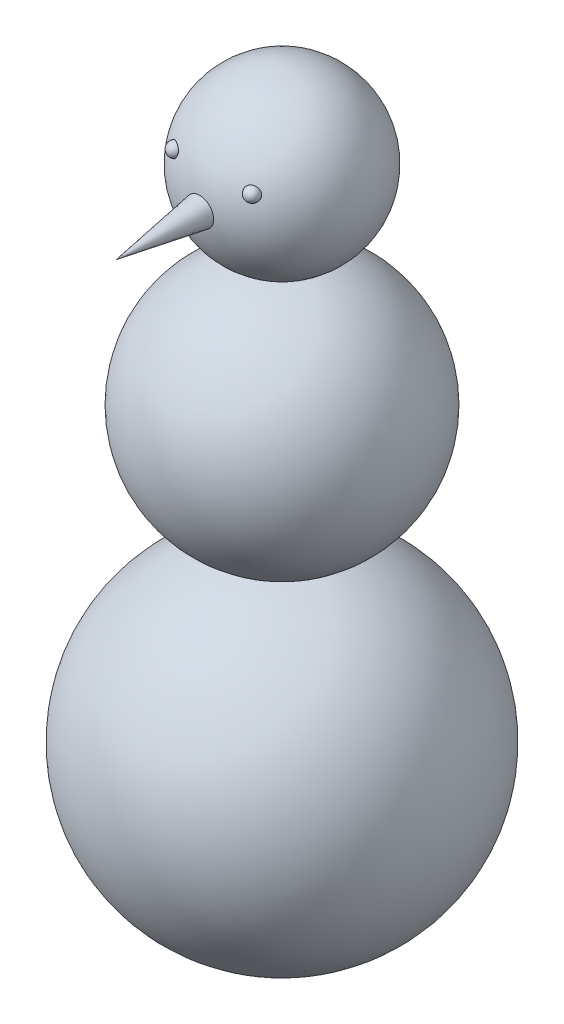
ISO-10303-21;
HEADER;
FILE_DESCRIPTION(('STEP AP214'),'2;1');
FILE_NAME('part.step','',(''),(''),'','','');
FILE_SCHEMA(('AUTOMOTIVE_DESIGN { 1 0 10303 214 1 1 1 1 }'));
ENDSEC;
DATA;
#1=APPLICATION_CONTEXT('core data for automotive mechanical design processes');
#2=APPLICATION_PROTOCOL_DEFINITION('international standard','automotive_design',2000,#1);
#3=PRODUCT_CONTEXT('',#1,'mechanical');
#4=PRODUCT('Part','Part','',(#3));
#5=PRODUCT_RELATED_PRODUCT_CATEGORY('part','',(#4));
#6=PRODUCT_DEFINITION_FORMATION('','',#4);
#7=PRODUCT_DEFINITION_CONTEXT('part definition',#1,'design');
#8=PRODUCT_DEFINITION('design','',#6,#7);
#9=PRODUCT_DEFINITION_SHAPE('','',#8);
#10=(LENGTH_UNIT() NAMED_UNIT(*) SI_UNIT(.MILLI.,.METRE.));
#11=(NAMED_UNIT(*) PLANE_ANGLE_UNIT() SI_UNIT($,.RADIAN.));
#12=(NAMED_UNIT(*) SI_UNIT($,.STERADIAN.) SOLID_ANGLE_UNIT());
#13=UNCERTAINTY_MEASURE_WITH_UNIT(LENGTH_MEASURE(1.E-05),#10,'distance_accuracy_value','');
#14=(GEOMETRIC_REPRESENTATION_CONTEXT(3) GLOBAL_UNCERTAINTY_ASSIGNED_CONTEXT((#13)) GLOBAL_UNIT_ASSIGNED_CONTEXT((#10,
#11,#12)) REPRESENTATION_CONTEXT('',''));
#15=CARTESIAN_POINT('',(0.,0.,0.));
#16=DIRECTION('',(0.,0.,1.));
#17=DIRECTION('',(1.,0.,0.));
#18=AXIS2_PLACEMENT_3D('',#15,#16,#17);
#19=CARTESIAN_POINT('',(0.,914.4,0.));
#20=DIRECTION('',(0.,-1.,0.));
#21=DIRECTION('',(-1.,0.,0.));
#22=AXIS2_PLACEMENT_3D('',#19,#20,#21);
#23=SPHERICAL_SURFACE('',#22,152.4);
#24=CARTESIAN_POINT('',(0.,914.4,150.26842649073));
#25=DIRECTION('',(0.,0.,-1.));
#26=DIRECTION('',(-1.,0.,0.));
#27=AXIS2_PLACEMENT_3D('',#24,#25,#26);
#28=CIRCLE('',#27,25.4);
#29=CARTESIAN_POINT('',(-25.4,914.4,150.26842649073));
#30=VERTEX_POINT('',#29);
#31=EDGE_CURVE('E123',#30,#30,#28,.T.);
#32=ORIENTED_EDGE('',*,*,#31,.T.);
#33=EDGE_LOOP('',(#32));
#34=FACE_BOUND('',#33,.T.);
#35=CARTESIAN_POINT('',(70.632787724483,965.2,125.124455236649));
#36=CARTESIAN_POINT('',(70.6326186899656,965.200063848411,125.124524734493));
#37=CARTESIAN_POINT('',(70.6324496553251,965.20012769698,125.124594231893));
#38=CARTESIAN_POINT('',(70.6321117386533,965.20025533649,125.124733163045));
#39=CARTESIAN_POINT('',(70.631942856622,965.20031912743,125.124802596798));
#40=CARTESIAN_POINT('',(70.6310984456866,965.200638081951,125.12514976383));
#41=CARTESIAN_POINT('',(70.6304229144443,965.200893244987,125.125427491924));
#42=CARTESIAN_POINT('',(70.6270452461944,965.202169059785,125.126816103465));
#43=CARTESIAN_POINT('',(70.6243430730746,965.2031897104,125.127926900125));
#44=CARTESIAN_POINT('',(70.6108320140857,965.208292953173,125.133480422708));
#45=CARTESIAN_POINT('',(70.6000225482999,965.21237551433,125.137921766369));
#46=CARTESIAN_POINT('',(70.5459721243665,965.232788163068,125.160121110532));
#47=CARTESIAN_POINT('',(70.5027218974501,965.249117773379,125.177856981934));
#48=CARTESIAN_POINT('',(70.2864210652077,965.33076336617,125.266418426689));
#49=CARTESIAN_POINT('',(70.113222406627,965.396071579628,125.336889835791));
#50=CARTESIAN_POINT('',(69.2464245818237,965.722576866616,125.687364128247));
#51=CARTESIAN_POINT('',(68.5504783712359,965.983641461147,125.96169139041));
#52=CARTESIAN_POINT('',(66.4545919187476,966.766610866138,126.766710161479));
#53=CARTESIAN_POINT('',(65.0473682626832,967.288000952464,127.27911388246));
#54=CARTESIAN_POINT('',(62.9231975126563,968.068602119726,128.010707054898));
#55=CARTESIAN_POINT('',(62.2128486955579,968.328580257245,128.248423914074));
#56=CARTESIAN_POINT('',(60.7878738553021,968.847980254103,128.711462807009));
#57=CARTESIAN_POINT('',(60.0732475529545,969.107402075595,128.936784021706));
#58=CARTESIAN_POINT('',(56.641901803289,970.347987787387,129.985758643503));
#59=CARTESIAN_POINT('',(53.8976966841214,971.325043578881,130.726285852884));
#60=CARTESIAN_POINT('',(48.3610487479235,973.266434621027,132.025541087695));
#61=CARTESIAN_POINT('',(45.5685881935664,974.230764954144,132.584200699657));
#62=CARTESIAN_POINT('',(41.3490886552726,975.665838248132,133.284587234015));
#63=CARTESIAN_POINT('',(39.9353834234604,976.142975257817,133.495320645088));
#64=CARTESIAN_POINT('',(37.1001863989797,977.09256072012,133.870268704049));
#65=CARTESIAN_POINT('',(35.6786945493295,977.565009138356,134.03448301105));
#66=CARTESIAN_POINT('',(32.8298954129761,978.504562001686,134.316163278837));
#67=CARTESIAN_POINT('',(31.4025903293799,978.971668254561,134.433645537402));
#68=CARTESIAN_POINT('',(28.5430817662526,979.900244794336,134.621839135923));
#69=CARTESIAN_POINT('',(27.1108783172458,980.361715116274,134.6925507668));
#70=CARTESIAN_POINT('',(25.6769217527268,980.82014057487,134.739825646759));
#71=B_SPLINE_CURVE_WITH_KNOTS('',3,(#35,#36,#37,#38,#39,#40,#41,#42,#43,#44,#45,#46,#47,#48,#49,
#50,#51,#52,#53,#54,#55,#56,#57,#58,#59,#60,#61,#62,#63,#64,#65,#66,#67,#68,#69,#70),
.UNSPECIFIED.,.F.,.F.,(4,2,2,2,2,2,2,2,2,2,2,2,2,2,2,2,2,4),(0.,0.000580786658377329,
0.00116104800865767,0.00348209340981893,0.0127662750190276,0.0499030017465191,0.198449927262511,
0.792638820124542,3.16947061174009,7.92577241576755,10.3043835207888,12.6831516077885,
21.6934449174305,30.7071237396068,35.2270791411994,39.7470676637245,44.2654784576226,
48.7838611461343),.UNSPECIFIED.);
#72=CARTESIAN_POINT('',(59.3378642558464,969.373275956889,129.161591799275));
#73=VERTEX_POINT('',#72);
#74=CARTESIAN_POINT('',(70.632787724483,965.2,125.124455236649));
#75=VERTEX_POINT('',#74);
#76=EDGE_CURVE('E110',#73,#75,#71,.F.);
#77=ORIENTED_EDGE('',*,*,#76,.T.);
#78=CARTESIAN_POINT('',(70.632787724483,965.2,125.124455236649));
#79=CARTESIAN_POINT('',(70.632956313379,965.199999999785,125.12436006826));
#80=CARTESIAN_POINT('',(70.633124902052,965.199999999746,125.124264899476));
#81=CARTESIAN_POINT('',(70.6334619265036,965.199999999816,125.124074647261));
#82=CARTESIAN_POINT('',(70.6336303622825,965.199999999923,125.12397956383));
#83=CARTESIAN_POINT('',(70.6344725402436,965.200000000308,125.12350414502));
#84=CARTESIAN_POINT('',(70.6351462796254,965.200000000129,125.123123804681));
#85=CARTESIAN_POINT('',(70.6385149611309,965.199999999486,125.121222075696));
#86=CARTESIAN_POINT('',(70.6412098570414,965.199999999785,125.119700605191));
#87=CARTESIAN_POINT('',(70.6546840909743,965.200000000858,125.112092817419));
#88=CARTESIAN_POINT('',(70.6654626918842,965.200000000358,125.106005194559));
#89=CARTESIAN_POINT('',(70.7193517672475,965.199999998566,125.075560112966));
#90=CARTESIAN_POINT('',(70.7624504379391,965.199999999402,125.051181761504));
#91=CARTESIAN_POINT('',(70.9778810983769,965.200000002393,124.929178430055));
#92=CARTESIAN_POINT('',(71.1500239720793,965.200000000991,124.831219313025));
#93=CARTESIAN_POINT('',(72.009744596154,965.199999996035,124.339633257871));
#94=CARTESIAN_POINT('',(72.6942747375153,965.199999998636,123.940672379068));
#95=CARTESIAN_POINT('',(74.7386308749941,965.200000002729,122.726405392283));
#96=CARTESIAN_POINT('',(76.0884516808625,965.200000000503,121.894138965378));
#97=CARTESIAN_POINT('',(78.0920006065753,965.199999999752,120.612554075788));
#98=CARTESIAN_POINT('',(78.7563831077579,965.199999999933,120.17978477104));
#99=CARTESIAN_POINT('',(80.0779293770016,965.200000000068,119.303285982425));
#100=CARTESIAN_POINT('',(80.735092665752,965.200000000023,118.8595557771));
#101=CARTESIAN_POINT('',(83.8638063451609,965.199999999912,116.70904769035));
#102=CARTESIAN_POINT('',(86.286147958519,965.200000000142,114.929738439044));
#103=CARTESIAN_POINT('',(91.0153288868217,965.200000000368,111.22212715137));
#104=CARTESIAN_POINT('',(93.3221244611416,965.200000000364,109.293769383904));
#105=CARTESIAN_POINT('',(96.6911099480694,965.199999999818,106.29308782813));
#106=CARTESIAN_POINT('',(97.8004445281128,965.199999999545,105.273280214643));
#107=CARTESIAN_POINT('',(99.9865346263031,965.200000000457,103.199238062865));
#108=CARTESIAN_POINT('',(101.063289905661,965.200000001642,102.145003272357));
#109=CARTESIAN_POINT('',(103.182726788895,965.200000001791,100.003567498507));
#110=CARTESIAN_POINT('',(104.225420155198,965.200000000755,98.9163781506559));
#111=CARTESIAN_POINT('',(106.27610621773,965.199999999253,96.7097637492981));
#112=CARTESIAN_POINT('',(107.284099129764,965.199999998787,95.5903388963461));
#113=CARTESIAN_POINT('',(108.27423806739,965.2,94.4553300292057));
#114=B_SPLINE_CURVE_WITH_KNOTS('',3,(#78,#79,#80,#81,#82,#83,#84,#85,#86,#87,#88,#89,#90,#91,
#92,#93,#94,#95,#96,#97,#98,#99,#100,#101,#102,#103,#104,#105,#106,#107,#108,#109,#110,#111,
#112,#113),.UNSPECIFIED.,.F.,.F.,(4,2,2,2,2,2,2,2,2,2,2,2,2,2,2,2,2,4),(0.,0.000580786658345131,
0.00116104800859367,0.00348209340963334,0.0127662750183127,0.0499030017437832,0.198449927251762,
0.79263882008179,3.16947061156935,7.92577241534032,10.3043835202333,12.6831516071046,
21.6934449167465,30.7071237389226,35.2270791405154,39.7470676630405,44.2654784569386,
48.7838611454504),.UNSPECIFIED.);
#115=CARTESIAN_POINT('',(81.40561663165,965.2,118.398672208859));
#116=VERTEX_POINT('',#115);
#117=EDGE_CURVE('E88',#75,#116,#114,.T.);
#118=ORIENTED_EDGE('',*,*,#117,.T.);
#119=CARTESIAN_POINT('',(70.3875349893286,965.023611111111,124.689995322633));
#120=DIRECTION('',(0.463469735724954,0.333333333333333,0.821026609164362));
#121=DIRECTION('',(0.870830224312076,0.,-0.491583889508778));
#122=AXIS2_PLACEMENT_3D('',#119,#120,#121);
#123=CIRCLE('',#122,12.6889709054315);
#124=EDGE_CURVE('E122',#116,#73,#123,.F.);
#125=ORIENTED_EDGE('',*,*,#124,.T.);
#126=EDGE_LOOP('',(#77,#118,#125));
#127=FACE_BOUND('',#126,.T.);
#128=CARTESIAN_POINT('',(-70.632787724483,965.2,125.124455236649));
#129=CARTESIAN_POINT('',(-70.632956313379,965.199999999785,125.12436006826));
#130=CARTESIAN_POINT('',(-70.633124902052,965.199999999746,125.124264899476));
#131=CARTESIAN_POINT('',(-70.6334619265036,965.199999999816,125.124074647261));
#132=CARTESIAN_POINT('',(-70.6336303622825,965.199999999923,125.12397956383));
#133=CARTESIAN_POINT('',(-70.6344725402436,965.200000000308,125.12350414502));
#134=CARTESIAN_POINT('',(-70.6351462796254,965.200000000129,125.123123804681));
#135=CARTESIAN_POINT('',(-70.6385149611309,965.199999999486,125.121222075696));
#136=CARTESIAN_POINT('',(-70.6412098570414,965.199999999785,125.119700605191));
#137=CARTESIAN_POINT('',(-70.6546840909743,965.200000000858,125.112092817419));
#138=CARTESIAN_POINT('',(-70.6654626918842,965.200000000358,125.106005194559));
#139=CARTESIAN_POINT('',(-70.7193517672475,965.199999998566,125.075560112966));
#140=CARTESIAN_POINT('',(-70.7624504379391,965.199999999402,125.051181761504));
#141=CARTESIAN_POINT('',(-70.9778810983769,965.200000002393,124.929178430055));
#142=CARTESIAN_POINT('',(-71.1500239720793,965.200000000991,124.831219313025));
#143=CARTESIAN_POINT('',(-72.009744596154,965.199999996035,124.339633257871));
#144=CARTESIAN_POINT('',(-72.6942747375153,965.199999998636,123.940672379068));
#145=CARTESIAN_POINT('',(-74.7386308749941,965.200000002729,122.726405392283));
#146=CARTESIAN_POINT('',(-76.0884516808625,965.200000000503,121.894138965378));
#147=CARTESIAN_POINT('',(-78.0920006065753,965.199999999752,120.612554075788));
#148=CARTESIAN_POINT('',(-78.7563831077579,965.199999999933,120.17978477104));
#149=CARTESIAN_POINT('',(-80.0779293770016,965.200000000068,119.303285982425));
#150=CARTESIAN_POINT('',(-80.735092665752,965.200000000023,118.8595557771));
#151=CARTESIAN_POINT('',(-83.8638063451609,965.199999999912,116.70904769035));
#152=CARTESIAN_POINT('',(-86.286147958519,965.200000000142,114.929738439044));
#153=CARTESIAN_POINT('',(-91.0153288868217,965.200000000368,111.22212715137));
#154=CARTESIAN_POINT('',(-93.3221244611416,965.200000000364,109.293769383904));
#155=CARTESIAN_POINT('',(-96.6911099480694,965.199999999818,106.29308782813));
#156=CARTESIAN_POINT('',(-97.8004445281128,965.199999999545,105.273280214643));
#157=CARTESIAN_POINT('',(-99.9865346263031,965.200000000457,103.199238062865));
#158=CARTESIAN_POINT('',(-101.063289905661,965.200000001642,102.145003272357));
#159=CARTESIAN_POINT('',(-103.182726788895,965.200000001791,100.003567498507));
#160=CARTESIAN_POINT('',(-104.225420155198,965.200000000755,98.9163781506559));
#161=CARTESIAN_POINT('',(-106.27610621773,965.199999999253,96.7097637492981));
#162=CARTESIAN_POINT('',(-107.284099129764,965.199999998787,95.5903388963461));
#163=CARTESIAN_POINT('',(-108.27423806739,965.2,94.4553300292057));
#164=B_SPLINE_CURVE_WITH_KNOTS('',3,(#128,#129,#130,#131,#132,#133,#134,#135,#136,#137,#138,
#139,#140,#141,#142,#143,#144,#145,#146,#147,#148,#149,#150,#151,#152,#153,#154,#155,#156,#157,
#158,#159,#160,#161,#162,#163),.UNSPECIFIED.,.F.,.F.,(4,2,2,2,2,2,2,2,2,2,2,2,2,2,2,2,2,4),(0.,
0.000580786658345131,0.00116104800859367,0.00348209340963334,0.0127662750183127,
0.0499030017437832,0.198449927251762,0.79263882008179,3.16947061156935,7.92577241534032,
10.3043835202333,12.6831516071046,21.6934449167465,30.7071237389226,35.2270791405154,
39.7470676630405,44.2654784569386,48.7838611454504),.UNSPECIFIED.);
#165=CARTESIAN_POINT('',(-81.40561663165,965.2,118.398672208859));
#166=VERTEX_POINT('',#165);
#167=CARTESIAN_POINT('',(-70.632787724483,965.2,125.124455236649));
#168=VERTEX_POINT('',#167);
#169=EDGE_CURVE('E55',#166,#168,#164,.F.);
#170=ORIENTED_EDGE('',*,*,#169,.T.);
#171=CARTESIAN_POINT('',(-70.632787724483,965.2,125.124455236649));
#172=CARTESIAN_POINT('',(-70.6326186899656,965.200063848411,125.124524734493));
#173=CARTESIAN_POINT('',(-70.6324496553251,965.20012769698,125.124594231893));
#174=CARTESIAN_POINT('',(-70.6321117386533,965.20025533649,125.124733163045));
#175=CARTESIAN_POINT('',(-70.631942856622,965.20031912743,125.124802596798));
#176=CARTESIAN_POINT('',(-70.6310984456866,965.200638081951,125.12514976383));
#177=CARTESIAN_POINT('',(-70.6304229144443,965.200893244987,125.125427491924));
#178=CARTESIAN_POINT('',(-70.6270452461944,965.202169059785,125.126816103465));
#179=CARTESIAN_POINT('',(-70.6243430730746,965.2031897104,125.127926900125));
#180=CARTESIAN_POINT('',(-70.6108320140857,965.208292953173,125.133480422708));
#181=CARTESIAN_POINT('',(-70.6000225482999,965.21237551433,125.137921766369));
#182=CARTESIAN_POINT('',(-70.5459721243665,965.232788163068,125.160121110532));
#183=CARTESIAN_POINT('',(-70.5027218974501,965.249117773379,125.177856981934));
#184=CARTESIAN_POINT('',(-70.2864210652077,965.33076336617,125.266418426689));
#185=CARTESIAN_POINT('',(-70.113222406627,965.396071579628,125.336889835791));
#186=CARTESIAN_POINT('',(-69.2464245818237,965.722576866616,125.687364128247));
#187=CARTESIAN_POINT('',(-68.5504783712359,965.983641461147,125.96169139041));
#188=CARTESIAN_POINT('',(-66.4545919187476,966.766610866138,126.766710161479));
#189=CARTESIAN_POINT('',(-65.0473682626832,967.288000952464,127.27911388246));
#190=CARTESIAN_POINT('',(-62.9231975126563,968.068602119726,128.010707054898));
#191=CARTESIAN_POINT('',(-62.2128486955579,968.328580257245,128.248423914074));
#192=CARTESIAN_POINT('',(-60.7878738553021,968.847980254103,128.711462807009));
#193=CARTESIAN_POINT('',(-60.0732475529545,969.107402075595,128.936784021706));
#194=CARTESIAN_POINT('',(-56.641901803289,970.347987787387,129.985758643503));
#195=CARTESIAN_POINT('',(-53.8976966841214,971.325043578881,130.726285852884));
#196=CARTESIAN_POINT('',(-48.3610487479235,973.266434621027,132.025541087695));
#197=CARTESIAN_POINT('',(-45.5685881935664,974.230764954144,132.584200699657));
#198=CARTESIAN_POINT('',(-41.3490886552726,975.665838248132,133.284587234015));
#199=CARTESIAN_POINT('',(-39.9353834234604,976.142975257817,133.495320645088));
#200=CARTESIAN_POINT('',(-37.1001863989797,977.09256072012,133.870268704049));
#201=CARTESIAN_POINT('',(-35.6786945493295,977.565009138356,134.03448301105));
#202=CARTESIAN_POINT('',(-32.8298954129761,978.504562001686,134.316163278837));
#203=CARTESIAN_POINT('',(-31.4025903293799,978.971668254561,134.433645537402));
#204=CARTESIAN_POINT('',(-28.5430817662526,979.900244794336,134.621839135923));
#205=CARTESIAN_POINT('',(-27.1108783172458,980.361715116274,134.6925507668));
#206=CARTESIAN_POINT('',(-25.6769217527268,980.82014057487,134.739825646759));
#207=B_SPLINE_CURVE_WITH_KNOTS('',3,(#171,#172,#173,#174,#175,#176,#177,#178,#179,#180,#181,
#182,#183,#184,#185,#186,#187,#188,#189,#190,#191,#192,#193,#194,#195,#196,#197,#198,#199,#200,
#201,#202,#203,#204,#205,#206),.UNSPECIFIED.,.F.,.F.,(4,2,2,2,2,2,2,2,2,2,2,2,2,2,2,2,2,4),(0.,
0.000580786658377329,0.00116104800865767,0.00348209340981893,0.0127662750190276,
0.0499030017465191,0.198449927262511,0.792638820124542,3.16947061174009,7.92577241576755,
10.3043835207888,12.6831516077885,21.6934449174305,30.7071237396068,35.2270791411994,
39.7470676637245,44.2654784576226,48.7838611461343),.UNSPECIFIED.);
#208=CARTESIAN_POINT('',(-59.3378642558464,969.373275956889,129.161591799275));
#209=VERTEX_POINT('',#208);
#210=EDGE_CURVE('E12',#168,#209,#207,.T.);
#211=ORIENTED_EDGE('',*,*,#210,.T.);
#212=CARTESIAN_POINT('',(-70.3875349893286,965.023611111111,124.689995322633));
#213=DIRECTION('',(-0.463469735724954,0.333333333333333,0.821026609164362));
#214=DIRECTION('',(0.870830224312076,0.,0.491583889508778));
#215=AXIS2_PLACEMENT_3D('',#212,#213,#214);
#216=CIRCLE('',#215,12.6889709054315);
#217=EDGE_CURVE('E87',#209,#166,#216,.F.);
#218=ORIENTED_EDGE('',*,*,#217,.T.);
#219=EDGE_LOOP('',(#170,#211,#218));
#220=FACE_BOUND('',#219,.T.);
#221=ADVANCED_FACE('F43',(#34,#127,#220),#23,.T.);
#222=CARTESIAN_POINT('',(0.,914.4,302.66842649073));
#223=DIRECTION('',(0.,0.,-1.));
#224=DIRECTION('',(-1.,0.,0.));
#225=AXIS2_PLACEMENT_3D('',#222,#223,#224);
#226=CONICAL_SURFACE('',#225,0.,0.165148677414627);
#227=ORIENTED_EDGE('',*,*,#31,.F.);
#228=EDGE_LOOP('',(#227));
#229=FACE_BOUND('',#228,.T.);
#230=CARTESIAN_POINT('',(0.,914.4,302.66842649073));
#231=VERTEX_POINT('',#230);
#232=VERTEX_LOOP('',#231);
#233=FACE_BOUND('',#232,.T.);
#234=ADVANCED_FACE('F106',(#229,#233),#226,.T.);
#235=CARTESIAN_POINT('',(0.,965.2,0.));
#236=DIRECTION('',(0.,-1.,0.));
#237=DIRECTION('',(0.898797936161028,0.,-0.438363171300553));
#238=AXIS2_PLACEMENT_3D('',#235,#236,#237);
#239=CIRCLE('',#238,143.684097937106);
#240=TRIMMED_CURVE('',#239,(PARAMETER_VALUE(-1.51066541063502)),
(PARAMETER_VALUE(1.51066541063502)),.T.,.PARAMETER.);
#241=CARTESIAN_POINT('',(7.76080634302487,965.2,-3.78511291971675));
#242=DIRECTION('',(0.438363171300553,0.,0.898797936161028));
#243=AXIS1_PLACEMENT('',#241,#242);
#244=SURFACE_OF_REVOLUTION('',#240,#243);
#245=ORIENTED_EDGE('',*,*,#117,.F.);
#246=ORIENTED_EDGE('',*,*,#76,.F.);
#247=CARTESIAN_POINT('',(70.0529610488917,965.2,123.935607601921));
#248=DIRECTION('',(0.438363171300553,0.,0.898797936161028));
#249=DIRECTION('',(0.898797936161028,0.,-0.438363171300553));
#250=AXIS2_PLACEMENT_3D('',#247,#248,#249);
#251=CIRCLE('',#250,12.630931965919);
#252=EDGE_CURVE('E68',#116,#73,#251,.T.);
#253=ORIENTED_EDGE('',*,*,#252,.F.);
#254=EDGE_LOOP('',(#245,#246,#253));
#255=FACE_BOUND('',#254,.T.);
#256=ADVANCED_FACE('F103',(#255),#244,.F.);
#257=CARTESIAN_POINT('',(70.632787724483,965.2,125.124455236649));
#258=DIRECTION('',(0.438363171300553,0.,0.898797936161028));
#259=DIRECTION('',(0.898797936161028,0.,-0.438363171300553));
#260=AXIS2_PLACEMENT_3D('',#257,#258,#259);
#261=SPHERICAL_SURFACE('',#260,12.7);
#262=ORIENTED_EDGE('',*,*,#124,.F.);
#263=ORIENTED_EDGE('',*,*,#252,.T.);
#264=EDGE_LOOP('',(#262,#263));
#265=FACE_BOUND('',#264,.T.);
#266=ADVANCED_FACE('F99',(#265),#261,.T.);
#267=CARTESIAN_POINT('',(0.,965.2,0.));
#268=DIRECTION('',(0.,1.,0.));
#269=DIRECTION('',(-0.898797936161028,0.,-0.438363171300553));
#270=AXIS2_PLACEMENT_3D('',#267,#268,#269);
#271=CIRCLE('',#270,143.684097937106);
#272=TRIMMED_CURVE('',#271,(PARAMETER_VALUE(-1.51066541063502)),
(PARAMETER_VALUE(1.51066541063502)),.T.,.PARAMETER.);
#273=CARTESIAN_POINT('',(-7.76080634302487,965.2,-3.78511291971675));
#274=DIRECTION('',(-0.438363171300553,0.,0.898797936161028));
#275=AXIS1_PLACEMENT('',#273,#274);
#276=SURFACE_OF_REVOLUTION('',#272,#275);
#277=ORIENTED_EDGE('',*,*,#210,.F.);
#278=ORIENTED_EDGE('',*,*,#169,.F.);
#279=CARTESIAN_POINT('',(-70.0529610488917,965.2,123.935607601921));
#280=DIRECTION('',(0.438363171300553,0.,-0.898797936161028));
#281=DIRECTION('',(-0.898797936161028,0.,-0.438363171300553));
#282=AXIS2_PLACEMENT_3D('',#279,#280,#281);
#283=CIRCLE('',#282,12.630931965919);
#284=EDGE_CURVE('E61',#166,#209,#283,.T.);
#285=ORIENTED_EDGE('',*,*,#284,.T.);
#286=EDGE_LOOP('',(#277,#278,#285));
#287=FACE_BOUND('',#286,.T.);
#288=ADVANCED_FACE('F84',(#287),#276,.F.);
#289=CARTESIAN_POINT('',(-70.632787724483,965.2,125.124455236649));
#290=DIRECTION('',(-0.438363171300553,0.,0.898797936161028));
#291=DIRECTION('',(-0.898797936161028,0.,-0.438363171300553));
#292=AXIS2_PLACEMENT_3D('',#289,#290,#291);
#293=SPHERICAL_SURFACE('',#292,12.7);
#294=ORIENTED_EDGE('',*,*,#217,.F.);
#295=ORIENTED_EDGE('',*,*,#284,.F.);
#296=EDGE_LOOP('',(#294,#295));
#297=FACE_BOUND('',#296,.T.);
#298=ADVANCED_FACE('F98',(#297),#293,.T.);
#299=CLOSED_SHELL('',(#221,#234,#256,#266,#288,#298));
#300=MANIFOLD_SOLID_BREP('B2',#299);
#301=CARTESIAN_POINT('',(0.,533.4,0.));
#302=DIRECTION('',(0.,-1.,0.));
#303=DIRECTION('',(1.,0.,0.));
#304=AXIS2_PLACEMENT_3D('',#301,#302,#303);
#305=SPHERICAL_SURFACE('',#304,228.6);
#306=CARTESIAN_POINT('',(0.,304.8,0.));
#307=VERTEX_POINT('',#306);
#308=VERTEX_LOOP('',#307);
#309=FACE_BOUND('',#308,.T.);
#310=ADVANCED_FACE('F183',(#309),#305,.T.);
#311=CLOSED_SHELL('',(#310));
#312=MANIFOLD_SOLID_BREP('B6',#311);
#313=CARTESIAN_POINT('',(0.,0.,0.));
#314=DIRECTION('',(0.,-1.,0.));
#315=DIRECTION('',(-1.,0.,0.));
#316=AXIS2_PLACEMENT_3D('',#313,#314,#315);
#317=SPHERICAL_SURFACE('',#316,304.8);
#318=CARTESIAN_POINT('',(0.,304.8,0.));
#319=VERTEX_POINT('',#318);
#320=VERTEX_LOOP('',#319);
#321=FACE_BOUND('',#320,.T.);
#322=ADVANCED_FACE('F195',(#321),#317,.T.);
#323=CLOSED_SHELL('',(#322));
#324=MANIFOLD_SOLID_BREP('B39',#323);
#325=ADVANCED_BREP_SHAPE_REPRESENTATION('',(#18,#300,#312,#324),#14);
#326=SHAPE_DEFINITION_REPRESENTATION(#9,#325);
ENDSEC;
END-ISO-10303-21;
